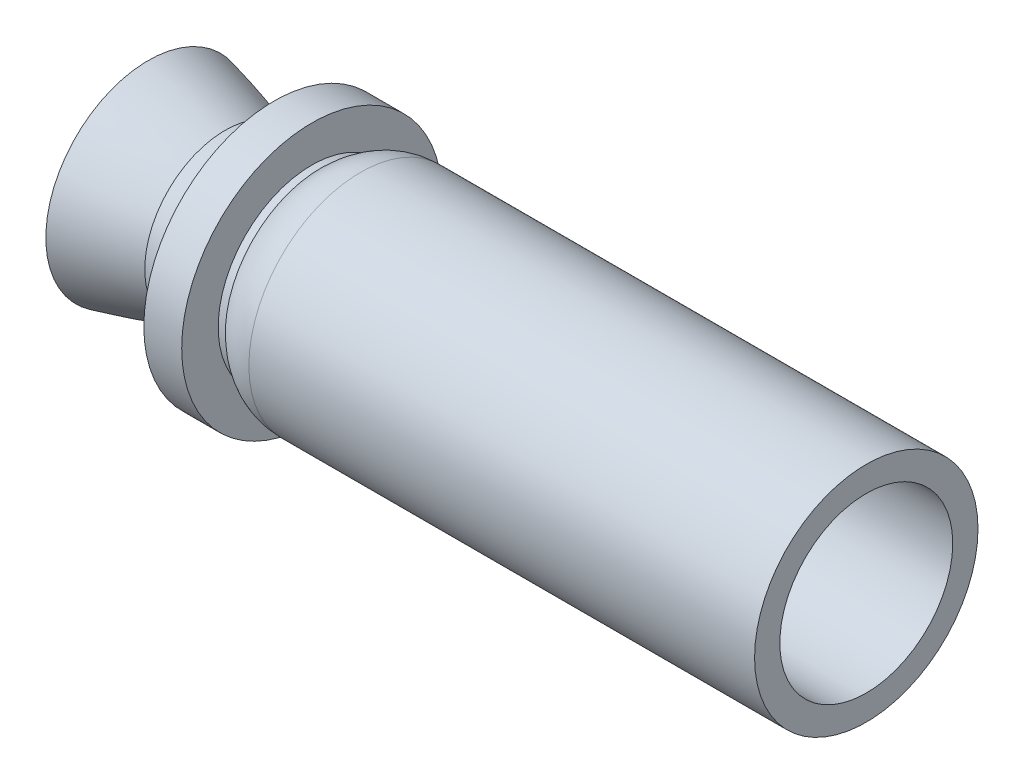
ISO-10303-21;
HEADER;
FILE_DESCRIPTION(('STEP AP214'),'2;1');
FILE_NAME('part.step','',(''),(''),'','','');
FILE_SCHEMA(('AUTOMOTIVE_DESIGN { 1 0 10303 214 1 1 1 1 }'));
ENDSEC;
DATA;
#1=APPLICATION_CONTEXT('core data for automotive mechanical design processes');
#2=APPLICATION_PROTOCOL_DEFINITION('international standard','automotive_design',2000,#1);
#3=PRODUCT_CONTEXT('',#1,'mechanical');
#4=PRODUCT('Part','Part','',(#3));
#5=PRODUCT_RELATED_PRODUCT_CATEGORY('part','',(#4));
#6=PRODUCT_DEFINITION_FORMATION('','',#4);
#7=PRODUCT_DEFINITION_CONTEXT('part definition',#1,'design');
#8=PRODUCT_DEFINITION('design','',#6,#7);
#9=PRODUCT_DEFINITION_SHAPE('','',#8);
#10=(LENGTH_UNIT() NAMED_UNIT(*) SI_UNIT(.MILLI.,.METRE.));
#11=(NAMED_UNIT(*) PLANE_ANGLE_UNIT() SI_UNIT($,.RADIAN.));
#12=(NAMED_UNIT(*) SI_UNIT($,.STERADIAN.) SOLID_ANGLE_UNIT());
#13=UNCERTAINTY_MEASURE_WITH_UNIT(LENGTH_MEASURE(1.E-05),#10,'distance_accuracy_value','');
#14=(GEOMETRIC_REPRESENTATION_CONTEXT(3) GLOBAL_UNCERTAINTY_ASSIGNED_CONTEXT((#13)) GLOBAL_UNIT_ASSIGNED_CONTEXT((#10,
#11,#12)) REPRESENTATION_CONTEXT('',''));
#15=CARTESIAN_POINT('',(0.,0.,0.));
#16=DIRECTION('',(0.,0.,1.));
#17=DIRECTION('',(1.,0.,0.));
#18=AXIS2_PLACEMENT_3D('',#15,#16,#17);
#19=CARTESIAN_POINT('',(13.5417033689859,0.,-41.2499999999755));
#20=DIRECTION('',(1.,0.,0.));
#21=DIRECTION('',(0.,0.,-1.));
#22=AXIS2_PLACEMENT_3D('',#19,#20,#21);
#23=PLANE('',#22);
#24=CARTESIAN_POINT('',(13.5417033689859,0.,0.));
#25=DIRECTION('',(1.,0.,0.));
#26=DIRECTION('',(0.,0.,-1.));
#27=AXIS2_PLACEMENT_3D('',#24,#25,#26);
#28=CIRCLE('',#27,16.120606076066);
#29=CARTESIAN_POINT('',(13.5417033689859,0.,-16.120606076066));
#30=VERTEX_POINT('',#29);
#31=EDGE_CURVE('E56',#30,#30,#28,.T.);
#32=ORIENTED_EDGE('',*,*,#31,.F.);
#33=EDGE_LOOP('',(#32));
#34=FACE_BOUND('',#33,.T.);
#35=CARTESIAN_POINT('',(13.5417033689859,0.,0.));
#36=DIRECTION('',(1.,0.,0.));
#37=DIRECTION('',(0.,0.,-1.));
#38=AXIS2_PLACEMENT_3D('',#35,#36,#37);
#39=CIRCLE('',#38,41.2499999999755);
#40=CARTESIAN_POINT('',(13.5417033689859,0.,-41.2499999999755));
#41=VERTEX_POINT('',#40);
#42=EDGE_CURVE('E60',#41,#41,#39,.T.);
#43=ORIENTED_EDGE('',*,*,#42,.T.);
#44=EDGE_LOOP('',(#43));
#45=FACE_BOUND('',#44,.T.);
#46=ADVANCED_FACE('F52',(#34,#45),#23,.T.);
#47=CARTESIAN_POINT('',(-40.1270102829806,0.,0.));
#48=DIRECTION('',(1.,0.,0.));
#49=DIRECTION('',(0.,0.,-1.));
#50=AXIS2_PLACEMENT_3D('',#47,#48,#49);
#51=CONICAL_SURFACE('',#50,24.64,1.34231515229828);
#52=CARTESIAN_POINT('',(-38.3150228285927,0.,0.));
#53=DIRECTION('',(1.,0.,0.));
#54=DIRECTION('',(0.,0.,-1.));
#55=AXIS2_PLACEMENT_3D('',#52,#53,#54);
#56=CIRCLE('',#55,32.4320922392603);
#57=CARTESIAN_POINT('',(-38.3150228285927,0.,-32.4320922392603));
#58=VERTEX_POINT('',#57);
#59=EDGE_CURVE('E128',#58,#58,#56,.T.);
#60=ORIENTED_EDGE('',*,*,#59,.F.);
#61=EDGE_LOOP('',(#60));
#62=FACE_BOUND('',#61,.T.);
#63=CARTESIAN_POINT('',(-40.1270102829806,0.,0.));
#64=DIRECTION('',(1.,0.,0.));
#65=DIRECTION('',(0.,0.,-1.));
#66=AXIS2_PLACEMENT_3D('',#63,#64,#65);
#67=CIRCLE('',#66,24.64);
#68=CARTESIAN_POINT('',(-40.1270102829806,0.,-24.64));
#69=VERTEX_POINT('',#68);
#70=EDGE_CURVE('E123',#69,#69,#67,.T.);
#71=ORIENTED_EDGE('',*,*,#70,.T.);
#72=EDGE_LOOP('',(#71));
#73=FACE_BOUND('',#72,.T.);
#74=ADVANCED_FACE('F84',(#62,#73),#51,.T.);
#75=CARTESIAN_POINT('',(0.,11.5361374682942,0.));
#76=CARTESIAN_POINT('',(-19.9482573544596,19.9475956971547,0.));
#77=CARTESIAN_POINT('',(-40.1270102829806,24.64,0.));
#78=B_SPLINE_CURVE_WITH_KNOTS('',2,(#75,#76,#77),.UNSPECIFIED.,.F.,.F.,(3,3),(0.,1.),.UNSPECIFIED.);
#79=CARTESIAN_POINT('',(0.,0.,0.));
#80=DIRECTION('',(1.,0.,0.));
#81=AXIS1_PLACEMENT('',#79,#80);
#82=SURFACE_OF_REVOLUTION('',#78,#81);
#83=ORIENTED_EDGE('',*,*,#70,.F.);
#84=EDGE_LOOP('',(#83));
#85=FACE_BOUND('',#84,.T.);
#86=CARTESIAN_POINT('',(0.,0.,0.));
#87=DIRECTION('',(1.,0.,0.));
#88=DIRECTION('',(0.,0.,-1.));
#89=AXIS2_PLACEMENT_3D('',#86,#87,#88);
#90=CIRCLE('',#89,11.5361374682942);
#91=CARTESIAN_POINT('',(0.,0.,-11.5361374682942));
#92=VERTEX_POINT('',#91);
#93=EDGE_CURVE('E119',#92,#92,#90,.T.);
#94=ORIENTED_EDGE('',*,*,#93,.T.);
#95=EDGE_LOOP('',(#94));
#96=FACE_BOUND('',#95,.T.);
#97=ADVANCED_FACE('F87',(#85,#96),#82,.T.);
#98=CARTESIAN_POINT('',(1.66230944505193,0.,0.));
#99=DIRECTION('',(1.,0.,0.));
#100=DIRECTION('',(0.,0.,-1.));
#101=AXIS2_PLACEMENT_3D('',#98,#99,#100);
#102=TOROIDAL_SURFACE('',#101,15.4784,4.2784);
#103=ORIENTED_EDGE('',*,*,#93,.F.);
#104=EDGE_LOOP('',(#103));
#105=FACE_BOUND('',#104,.T.);
#106=CARTESIAN_POINT('',(1.66230944505193,0.,0.));
#107=DIRECTION('',(1.,0.,0.));
#108=DIRECTION('',(0.,0.,-1.));
#109=AXIS2_PLACEMENT_3D('',#106,#107,#108);
#110=CIRCLE('',#109,11.2);
#111=CARTESIAN_POINT('',(1.66230944505193,0.,-11.2));
#112=VERTEX_POINT('',#111);
#113=EDGE_CURVE('E115',#112,#112,#110,.T.);
#114=ORIENTED_EDGE('',*,*,#113,.T.);
#115=EDGE_LOOP('',(#114));
#116=FACE_BOUND('',#115,.T.);
#117=ADVANCED_FACE('F91',(#105,#116),#102,.T.);
#118=CARTESIAN_POINT('',(1.66230944505193,0.,0.));
#119=DIRECTION('',(1.,0.,0.));
#120=DIRECTION('',(0.,0.,-1.));
#121=AXIS2_PLACEMENT_3D('',#118,#119,#120);
#122=TOROIDAL_SURFACE('',#121,28.,16.8);
#123=ORIENTED_EDGE('',*,*,#113,.F.);
#124=EDGE_LOOP('',(#123));
#125=FACE_BOUND('',#124,.T.);
#126=ORIENTED_EDGE('',*,*,#31,.T.);
#127=EDGE_LOOP('',(#126));
#128=FACE_BOUND('',#127,.T.);
#129=ADVANCED_FACE('F82',(#125,#128),#122,.T.);
#130=CARTESIAN_POINT('',(2.34818467411675,19.2267693994655,0.));
#131=CARTESIAN_POINT('',(0.31354563692423,20.0775060385211,0.));
#132=CARTESIAN_POINT('',(-5.8002726091552,22.5182343127452,0.));
#133=CARTESIAN_POINT('',(-13.9783879953932,25.4749777747112,0.));
#134=CARTESIAN_POINT('',(-28.1601907718546,30.0701216733316,0.));
#135=CARTESIAN_POINT('',(-38.3150228285927,32.4320922392603,0.));
#136=B_SPLINE_CURVE_WITH_KNOTS('',2,(#130,#131,#132,#133,#134,#135),.UNSPECIFIED.,.F.,.F.,(3,1,
1,1,3),(0.018493807027929,0.117487589472404,0.315475154361354,0.513462719250305,1.),.UNSPECIFIED.);
#137=CARTESIAN_POINT('',(0.,0.,0.));
#138=DIRECTION('',(1.,0.,0.));
#139=AXIS1_PLACEMENT('',#137,#138);
#140=SURFACE_OF_REVOLUTION('',#136,#139);
#141=ORIENTED_EDGE('',*,*,#59,.T.);
#142=EDGE_LOOP('',(#141));
#143=FACE_BOUND('',#142,.T.);
#144=CARTESIAN_POINT('',(-13.9815869337929,0.,0.));
#145=DIRECTION('',(1.,0.,0.));
#146=DIRECTION('',(0.,0.,-1.));
#147=AXIS2_PLACEMENT_3D('',#144,#145,#146);
#148=CIRCLE('',#147,25.4376523106333);
#149=CARTESIAN_POINT('',(-13.9815869337929,0.,-25.4376523106333));
#150=VERTEX_POINT('',#149);
#151=EDGE_CURVE('E131',#150,#150,#148,.T.);
#152=ORIENTED_EDGE('',*,*,#151,.F.);
#153=EDGE_LOOP('',(#152));
#154=FACE_BOUND('',#153,.T.);
#155=ADVANCED_FACE('F79',(#143,#154),#140,.F.);
#156=CARTESIAN_POINT('',(16.2213148719435,0.,0.));
#157=DIRECTION('',(1.,0.,0.));
#158=DIRECTION('',(0.,0.,-1.));
#159=AXIS2_PLACEMENT_3D('',#156,#157,#158);
#160=CONICAL_SURFACE('',#159,30.1139260780083,0.153608941783486);
#161=ORIENTED_EDGE('',*,*,#151,.T.);
#162=EDGE_LOOP('',(#161));
#163=FACE_BOUND('',#162,.T.);
#164=CARTESIAN_POINT('',(1.54170336898594,0.,0.));
#165=DIRECTION('',(1.,0.,0.));
#166=DIRECTION('',(0.,0.,-1.));
#167=AXIS2_PLACEMENT_3D('',#164,#165,#166);
#168=CIRCLE('',#167,27.8411020087164);
#169=CARTESIAN_POINT('',(1.54170336898594,0.,-27.8411020087164));
#170=VERTEX_POINT('',#169);
#171=EDGE_CURVE('E64',#170,#170,#168,.F.);
#172=ORIENTED_EDGE('',*,*,#171,.T.);
#173=EDGE_LOOP('',(#172));
#174=FACE_BOUND('',#173,.T.);
#175=ADVANCED_FACE('F54',(#163,#174),#160,.T.);
#176=CARTESIAN_POINT('',(1.54170336898595,0.,0.));
#177=DIRECTION('',(1.,0.,0.));
#178=DIRECTION('',(0.,0.,-1.));
#179=AXIS2_PLACEMENT_3D('',#176,#177,#178);
#180=PLANE('',#179);
#181=ORIENTED_EDGE('',*,*,#171,.F.);
#182=EDGE_LOOP('',(#181));
#183=FACE_BOUND('',#182,.T.);
#184=CARTESIAN_POINT('',(1.54170336898594,0.,0.));
#185=DIRECTION('',(1.,0.,0.));
#186=DIRECTION('',(0.,0.,-1.));
#187=AXIS2_PLACEMENT_3D('',#184,#185,#186);
#188=CIRCLE('',#187,41.2499999999755);
#189=CARTESIAN_POINT('',(1.54170336898594,0.,-41.2499999999755));
#190=VERTEX_POINT('',#189);
#191=EDGE_CURVE('E11',#190,#190,#188,.T.);
#192=ORIENTED_EDGE('',*,*,#191,.F.);
#193=EDGE_LOOP('',(#192));
#194=FACE_BOUND('',#193,.T.);
#195=ADVANCED_FACE('F102',(#183,#194),#180,.F.);
#196=CARTESIAN_POINT('',(0.,0.,0.));
#197=DIRECTION('',(1.,0.,0.));
#198=DIRECTION('',(0.,0.,-1.));
#199=AXIS2_PLACEMENT_3D('',#196,#197,#198);
#200=CYLINDRICAL_SURFACE('',#199,41.2499999999755);
#201=ORIENTED_EDGE('',*,*,#42,.F.);
#202=EDGE_LOOP('',(#201));
#203=FACE_BOUND('',#202,.T.);
#204=ORIENTED_EDGE('',*,*,#191,.T.);
#205=EDGE_LOOP('',(#204));
#206=FACE_BOUND('',#205,.T.);
#207=ADVANCED_FACE('F99',(#203,#206),#200,.T.);
#208=CLOSED_SHELL('',(#46,#74,#97,#117,#129,#155,#175,#195,#207));
#209=MANIFOLD_SOLID_BREP('B2_NOT_SHOWN',#208);
#210=CARTESIAN_POINT('',(13.5417033689859,0.,-41.2499999999755));
#211=DIRECTION('',(1.,0.,0.));
#212=DIRECTION('',(0.,0.,-1.));
#213=AXIS2_PLACEMENT_3D('',#210,#211,#212);
#214=PLANE('',#213);
#215=CARTESIAN_POINT('',(13.5417033689859,0.,0.));
#216=DIRECTION('',(1.,0.,0.));
#217=DIRECTION('',(0.,0.,-1.));
#218=AXIS2_PLACEMENT_3D('',#215,#216,#217);
#219=CIRCLE('',#218,29.6990455126033);
#220=CARTESIAN_POINT('',(13.5417033689859,0.,-29.6990455126033));
#221=VERTEX_POINT('',#220);
#222=EDGE_CURVE('E226',#221,#221,#219,.F.);
#223=ORIENTED_EDGE('',*,*,#222,.T.);
#224=EDGE_LOOP('',(#223));
#225=FACE_BOUND('',#224,.T.);
#226=CARTESIAN_POINT('',(13.5417033689859,0.,0.));
#227=DIRECTION('',(1.,0.,0.));
#228=DIRECTION('',(0.,0.,-1.));
#229=AXIS2_PLACEMENT_3D('',#226,#227,#228);
#230=CIRCLE('',#229,16.120606076066);
#231=CARTESIAN_POINT('',(13.5417033689859,0.,-16.120606076066));
#232=VERTEX_POINT('',#231);
#233=EDGE_CURVE('E51',#232,#232,#230,.T.);
#234=ORIENTED_EDGE('',*,*,#233,.T.);
#235=EDGE_LOOP('',(#234));
#236=FACE_BOUND('',#235,.T.);
#237=ADVANCED_FACE('F223',(#225,#236),#214,.F.);
#238=CARTESIAN_POINT('',(16.2213148719435,0.,0.));
#239=DIRECTION('',(1.,0.,0.));
#240=DIRECTION('',(0.,0.,-1.));
#241=AXIS2_PLACEMENT_3D('',#238,#239,#240);
#242=CONICAL_SURFACE('',#241,30.1139260780083,0.153608941783486);
#243=ORIENTED_EDGE('',*,*,#222,.F.);
#244=EDGE_LOOP('',(#243));
#245=FACE_BOUND('',#244,.T.);
#246=CARTESIAN_POINT('',(16.2213148719435,0.,0.));
#247=DIRECTION('',(1.,0.,0.));
#248=DIRECTION('',(0.,0.,-1.));
#249=AXIS2_PLACEMENT_3D('',#246,#247,#248);
#250=CIRCLE('',#249,30.1139260780083);
#251=CARTESIAN_POINT('',(16.2213148719435,0.,-30.1139260780083));
#252=VERTEX_POINT('',#251);
#253=EDGE_CURVE('E256',#252,#252,#250,.T.);
#254=ORIENTED_EDGE('',*,*,#253,.F.);
#255=EDGE_LOOP('',(#254));
#256=FACE_BOUND('',#255,.T.);
#257=ADVANCED_FACE('F264',(#245,#256),#242,.T.);
#258=CARTESIAN_POINT('',(21.8781691214359,0.,0.));
#259=DIRECTION('',(1.,0.,0.));
#260=DIRECTION('',(0.,0.,-1.));
#261=AXIS2_PLACEMENT_3D('',#258,#259,#260);
#262=CONICAL_SURFACE('',#261,24.457071828516,0.785398163397449);
#263=ORIENTED_EDGE('',*,*,#233,.F.);
#264=EDGE_LOOP('',(#263));
#265=FACE_BOUND('',#264,.T.);
#266=CARTESIAN_POINT('',(21.8781691214359,0.,0.));
#267=DIRECTION('',(1.,0.,0.));
#268=DIRECTION('',(0.,0.,-1.));
#269=AXIS2_PLACEMENT_3D('',#266,#267,#268);
#270=CIRCLE('',#269,24.457071828516);
#271=CARTESIAN_POINT('',(21.8781691214359,0.,-24.457071828516));
#272=VERTEX_POINT('',#271);
#273=EDGE_CURVE('E235',#272,#272,#270,.T.);
#274=ORIENTED_EDGE('',*,*,#273,.T.);
#275=EDGE_LOOP('',(#274));
#276=FACE_BOUND('',#275,.T.);
#277=ADVANCED_FACE('F266',(#265,#276),#262,.F.);
#278=CARTESIAN_POINT('',(28.9492369333014,0.,0.));
#279=DIRECTION('',(1.,0.,0.));
#280=DIRECTION('',(0.,0.,-1.));
#281=AXIS2_PLACEMENT_3D('',#278,#279,#280);
#282=TOROIDAL_SURFACE('',#281,17.3860040166505,10.);
#283=ORIENTED_EDGE('',*,*,#273,.F.);
#284=EDGE_LOOP('',(#283));
#285=FACE_BOUND('',#284,.T.);
#286=CARTESIAN_POINT('',(28.9492369333014,0.,0.));
#287=DIRECTION('',(1.,0.,0.));
#288=DIRECTION('',(0.,0.,-1.));
#289=AXIS2_PLACEMENT_3D('',#286,#287,#288);
#290=CIRCLE('',#289,27.3860040166505);
#291=CARTESIAN_POINT('',(28.9492369333014,0.,-27.3860040166505));
#292=VERTEX_POINT('',#291);
#293=EDGE_CURVE('E240',#292,#292,#290,.T.);
#294=ORIENTED_EDGE('',*,*,#293,.T.);
#295=EDGE_LOOP('',(#294));
#296=FACE_BOUND('',#295,.T.);
#297=ADVANCED_FACE('F272',(#285,#296),#282,.F.);
#298=CARTESIAN_POINT('',(0.,0.,0.));
#299=DIRECTION('',(1.,0.,0.));
#300=DIRECTION('',(0.,0.,-1.));
#301=AXIS2_PLACEMENT_3D('',#298,#299,#300);
#302=CYLINDRICAL_SURFACE('',#301,27.3860040166505);
#303=ORIENTED_EDGE('',*,*,#293,.F.);
#304=EDGE_LOOP('',(#303));
#305=FACE_BOUND('',#304,.T.);
#306=CARTESIAN_POINT('',(189.133015330605,0.,0.));
#307=DIRECTION('',(1.,0.,0.));
#308=DIRECTION('',(0.,0.,-1.));
#309=AXIS2_PLACEMENT_3D('',#306,#307,#308);
#310=CIRCLE('',#309,27.3860040166505);
#311=CARTESIAN_POINT('',(189.133015330605,0.,-27.3860040166505));
#312=VERTEX_POINT('',#311);
#313=EDGE_CURVE('E244',#312,#312,#310,.T.);
#314=ORIENTED_EDGE('',*,*,#313,.T.);
#315=EDGE_LOOP('',(#314));
#316=FACE_BOUND('',#315,.T.);
#317=ADVANCED_FACE('F280',(#305,#316),#302,.F.);
#318=CARTESIAN_POINT('',(189.133015330605,0.,0.));
#319=DIRECTION('',(1.,0.,0.));
#320=DIRECTION('',(0.,0.,-1.));
#321=AXIS2_PLACEMENT_3D('',#318,#319,#320);
#322=PLANE('',#321);
#323=CARTESIAN_POINT('',(189.133015330605,0.,0.));
#324=DIRECTION('',(1.,0.,0.));
#325=DIRECTION('',(0.,0.,-1.));
#326=AXIS2_PLACEMENT_3D('',#323,#324,#325);
#327=CIRCLE('',#326,35.3860040166505);
#328=CARTESIAN_POINT('',(189.133015330605,0.,-35.3860040166505));
#329=VERTEX_POINT('',#328);
#330=EDGE_CURVE('E248',#329,#329,#327,.T.);
#331=ORIENTED_EDGE('',*,*,#330,.T.);
#332=EDGE_LOOP('',(#331));
#333=FACE_BOUND('',#332,.T.);
#334=ORIENTED_EDGE('',*,*,#313,.F.);
#335=EDGE_LOOP('',(#334));
#336=FACE_BOUND('',#335,.T.);
#337=ADVANCED_FACE('F284',(#333,#336),#322,.T.);
#338=CARTESIAN_POINT('',(0.,0.,0.));
#339=DIRECTION('',(1.,0.,0.));
#340=DIRECTION('',(0.,0.,-1.));
#341=AXIS2_PLACEMENT_3D('',#338,#339,#340);
#342=CYLINDRICAL_SURFACE('',#341,35.3860040166505);
#343=CARTESIAN_POINT('',(28.9492369333014,0.,0.));
#344=DIRECTION('',(1.,0.,0.));
#345=DIRECTION('',(0.,0.,-1.));
#346=AXIS2_PLACEMENT_3D('',#343,#344,#345);
#347=CIRCLE('',#346,35.3860040166505);
#348=CARTESIAN_POINT('',(28.9492369333014,0.,-35.3860040166505));
#349=VERTEX_POINT('',#348);
#350=EDGE_CURVE('E252',#349,#349,#347,.T.);
#351=ORIENTED_EDGE('',*,*,#350,.T.);
#352=EDGE_LOOP('',(#351));
#353=FACE_BOUND('',#352,.T.);
#354=ORIENTED_EDGE('',*,*,#330,.F.);
#355=EDGE_LOOP('',(#354));
#356=FACE_BOUND('',#355,.T.);
#357=ADVANCED_FACE('F288',(#353,#356),#342,.T.);
#358=CARTESIAN_POINT('',(28.9492369333014,0.,0.));
#359=DIRECTION('',(1.,0.,0.));
#360=DIRECTION('',(0.,0.,-1.));
#361=AXIS2_PLACEMENT_3D('',#358,#359,#360);
#362=DEGENERATE_TOROIDAL_SURFACE('',#361,17.3860040166505,18.,.T.);
#363=ORIENTED_EDGE('',*,*,#253,.T.);
#364=EDGE_LOOP('',(#363));
#365=FACE_BOUND('',#364,.T.);
#366=ORIENTED_EDGE('',*,*,#350,.F.);
#367=EDGE_LOOP('',(#366));
#368=FACE_BOUND('',#367,.T.);
#369=ADVANCED_FACE('F261',(#365,#368),#362,.T.);
#370=CLOSED_SHELL('',(#237,#257,#277,#297,#317,#337,#357,#369));
#371=MANIFOLD_SOLID_BREP('B6',#370);
#372=ADVANCED_BREP_SHAPE_REPRESENTATION('',(#18,#209,#371),#14);
#373=SHAPE_DEFINITION_REPRESENTATION(#9,#372);
ENDSEC;
END-ISO-10303-21;
